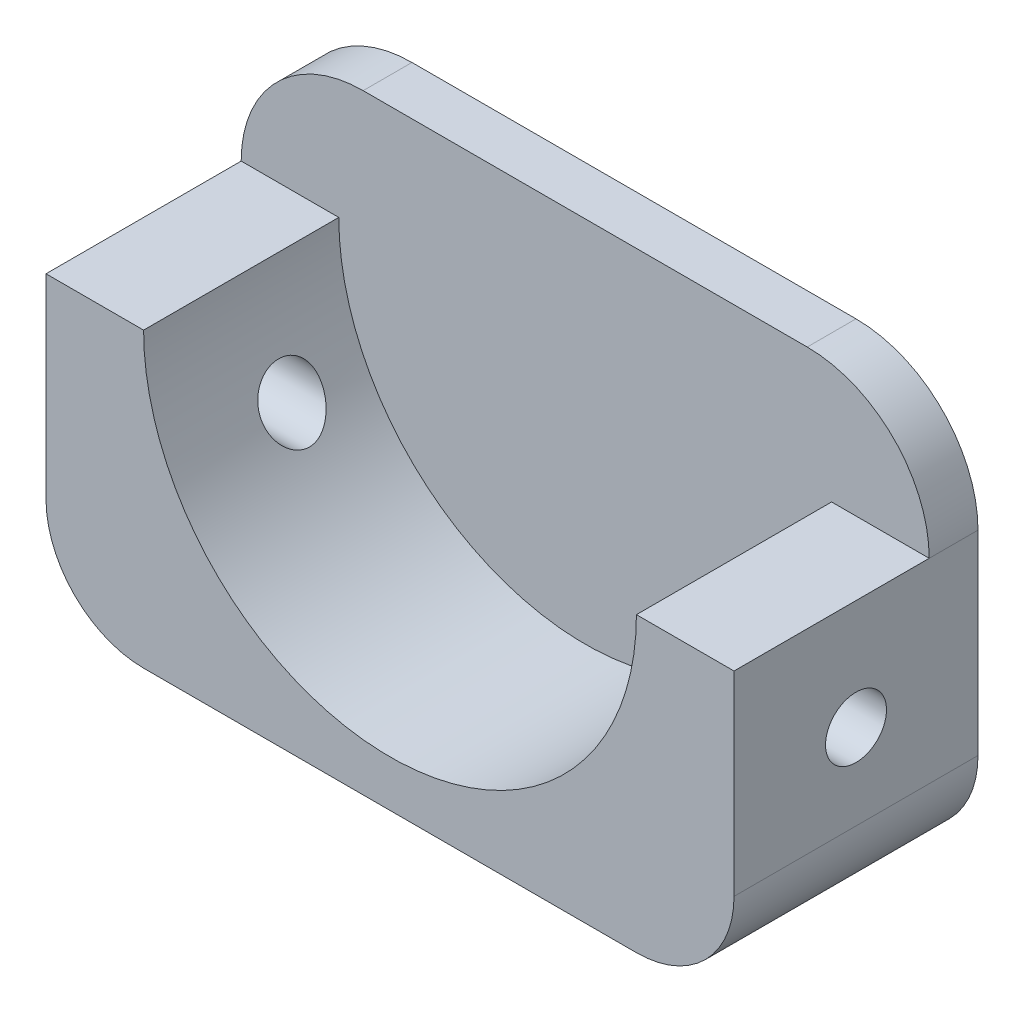
ISO-10303-21;
HEADER;
FILE_DESCRIPTION(('STEP AP214'),'2;1');
FILE_NAME('part.step','',(''),(''),'','','');
FILE_SCHEMA(('AUTOMOTIVE_DESIGN { 1 0 10303 214 1 1 1 1 }'));
ENDSEC;
DATA;
#1=APPLICATION_CONTEXT('core data for automotive mechanical design processes');
#2=APPLICATION_PROTOCOL_DEFINITION('international standard','automotive_design',2000,#1);
#3=PRODUCT_CONTEXT('',#1,'mechanical');
#4=PRODUCT('Part','Part','',(#3));
#5=PRODUCT_RELATED_PRODUCT_CATEGORY('part','',(#4));
#6=PRODUCT_DEFINITION_FORMATION('','',#4);
#7=PRODUCT_DEFINITION_CONTEXT('part definition',#1,'design');
#8=PRODUCT_DEFINITION('design','',#6,#7);
#9=PRODUCT_DEFINITION_SHAPE('','',#8);
#10=(LENGTH_UNIT() NAMED_UNIT(*) SI_UNIT(.MILLI.,.METRE.));
#11=(NAMED_UNIT(*) PLANE_ANGLE_UNIT() SI_UNIT($,.RADIAN.));
#12=(NAMED_UNIT(*) SI_UNIT($,.STERADIAN.) SOLID_ANGLE_UNIT());
#13=UNCERTAINTY_MEASURE_WITH_UNIT(LENGTH_MEASURE(1.E-05),#10,'distance_accuracy_value','');
#14=(GEOMETRIC_REPRESENTATION_CONTEXT(3) GLOBAL_UNCERTAINTY_ASSIGNED_CONTEXT((#13)) GLOBAL_UNIT_ASSIGNED_CONTEXT((#10,
#11,#12)) REPRESENTATION_CONTEXT('',''));
#15=CARTESIAN_POINT('',(0.,0.,0.));
#16=DIRECTION('',(0.,0.,1.));
#17=DIRECTION('',(1.,0.,0.));
#18=AXIS2_PLACEMENT_3D('',#15,#16,#17);
#19=CARTESIAN_POINT('',(0.,0.,8.));
#20=DIRECTION('',(0.,0.,-1.));
#21=DIRECTION('',(-1.,0.,0.));
#22=AXIS2_PLACEMENT_3D('',#19,#20,#21);
#23=CYLINDRICAL_SURFACE('',#22,10.1);
#24=CARTESIAN_POINT('',(8.30346313293436,-5.75,3.));
#25=CARTESIAN_POINT('',(8.30346556023614,-5.74999719009385,2.93819606402658));
#26=CARTESIAN_POINT('',(8.30666253794561,-5.74538818088564,2.87636810832759));
#27=CARTESIAN_POINT('',(8.31918849945746,-5.72723476561262,2.75466607289741));
#28=CARTESIAN_POINT('',(8.32852213400869,-5.71368358257126,2.69479351124059));
#29=CARTESIAN_POINT('',(8.35254823952259,-5.67850195180862,2.57895004306229));
#30=CARTESIAN_POINT('',(8.36721628534955,-5.65690831806253,2.52296271656013));
#31=CARTESIAN_POINT('',(8.40098319782812,-5.60663846307656,2.41573809306071));
#32=CARTESIAN_POINT('',(8.42008305926459,-5.57796065159741,2.36450186613555));
#33=CARTESIAN_POINT('',(8.46335216284389,-5.51210801091915,2.26377187517909));
#34=CARTESIAN_POINT('',(8.4877984122271,-5.47444911849473,2.21471564420032));
#35=CARTESIAN_POINT('',(8.53960366888568,-5.39328194048506,2.12348391792342));
#36=CARTESIAN_POINT('',(8.56696399471795,-5.34977100461607,2.08131155947416));
#37=CARTESIAN_POINT('',(8.62843651103174,-5.25014793771408,1.99765710152075));
#38=CARTESIAN_POINT('',(8.66290868298089,-5.19314862181283,1.95749401480626));
#39=CARTESIAN_POINT('',(8.73326049768454,-5.0739492081012,1.88740434114792));
#40=CARTESIAN_POINT('',(8.76914103633603,-5.01174577039749,1.85748439172002));
#41=CARTESIAN_POINT('',(8.84565705731332,-4.87556761225449,1.80526404736326));
#42=CARTESIAN_POINT('',(8.88633703510027,-4.80108396606182,1.78434437627409));
#43=CARTESIAN_POINT('',(8.96681116872334,-4.64905355749156,1.75651426727098));
#44=CARTESIAN_POINT('',(9.00660508173845,-4.57150597122646,1.74960762393158));
#45=CARTESIAN_POINT('',(9.08497285398777,-4.41374922403769,1.75043532846569));
#46=CARTESIAN_POINT('',(9.12350228106662,-4.33351864144995,1.75848666206291));
#47=CARTESIAN_POINT('',(9.19727046145158,-4.17467071488345,1.79036619859532));
#48=CARTESIAN_POINT('',(9.23251050870979,-4.0960527461233,1.8141881676968));
#49=CARTESIAN_POINT('',(9.2964582732351,-3.94865641420649,1.87551958042695));
#50=CARTESIAN_POINT('',(9.32544625377431,-3.87957203468222,1.91199759398857));
#51=CARTESIAN_POINT('',(9.37898527809888,-3.74828749992423,1.99821041672907));
#52=CARTESIAN_POINT('',(9.40353918532415,-3.68608291198515,2.04793661874442));
#53=CARTESIAN_POINT('',(9.44561319446128,-3.57680112262028,2.15415257635107));
#54=CARTESIAN_POINT('',(9.46357691696196,-3.52885243850489,2.20957115465423));
#55=CARTESIAN_POINT('',(9.49516424072192,-3.44295749338124,2.32877052188886));
#56=CARTESIAN_POINT('',(9.50878982270049,-3.40500666889448,2.392547475701));
#57=CARTESIAN_POINT('',(9.53073812129178,-3.34305828377764,2.52171985345153));
#58=CARTESIAN_POINT('',(9.53936761185198,-3.31826400381453,2.58668216168136));
#59=CARTESIAN_POINT('',(9.55268103474357,-3.27974164080753,2.7201922230024));
#60=CARTESIAN_POINT('',(9.55736594658295,-3.26601081055177,2.788739081494));
#61=CARTESIAN_POINT('',(9.5626663782811,-3.25045786660317,2.92476743305255));
#62=CARTESIAN_POINT('',(9.56342469122017,-3.24821790954192,2.99219595890161));
#63=CARTESIAN_POINT('',(9.56125458213028,-3.25460014895181,3.12647312414225));
#64=CARTESIAN_POINT('',(9.55832651876996,-3.26322128868473,3.19332181931174));
#65=CARTESIAN_POINT('',(9.54884241822029,-3.290868678329,3.32390586918177));
#66=CARTESIAN_POINT('',(9.54232028356174,-3.30979767580442,3.38766435001725));
#67=CARTESIAN_POINT('',(9.52571131927064,-3.35729845384523,3.51097881148743));
#68=CARTESIAN_POINT('',(9.51562444016886,-3.38587036822857,3.57053473378796));
#69=CARTESIAN_POINT('',(9.4918018866433,-3.45209310902203,3.68469389043521));
#70=CARTESIAN_POINT('',(9.4780175634763,-3.48986431524272,3.7392170121708));
#71=CARTESIAN_POINT('',(9.44701350197029,-3.57293960221027,3.84105870376038));
#72=CARTESIAN_POINT('',(9.42979332454585,-3.61824464562142,3.88837635142578));
#73=CARTESIAN_POINT('',(9.39140229025165,-3.71678086275272,3.97652747695715));
#74=CARTESIAN_POINT('',(9.37010362165229,-3.77025212380682,4.01703638635577));
#75=CARTESIAN_POINT('',(9.32437106796839,-3.88197736053812,4.0885548938557));
#76=CARTESIAN_POINT('',(9.29993637955408,-3.94023256029773,4.11956205104861));
#77=CARTESIAN_POINT('',(9.24662633510926,-4.06383074316232,4.17349898079297));
#78=CARTESIAN_POINT('',(9.21756355854991,-4.12938734769868,4.19575271320218));
#79=CARTESIAN_POINT('',(9.15693084584126,-4.26215335638563,4.22907249479892));
#80=CARTESIAN_POINT('',(9.12535997767353,-4.32936336848486,4.24013436386626));
#81=CARTESIAN_POINT('',(9.05753191151787,-4.46964131311799,4.25177958391763));
#82=CARTESIAN_POINT('',(9.02110594527217,-4.54271029853599,4.25136784518746));
#83=CARTESIAN_POINT('',(8.94697035997738,-4.68703692970512,4.23805301428341));
#84=CARTESIAN_POINT('',(8.90926024923946,-4.75829386297282,4.22514508432931));
#85=CARTESIAN_POINT('',(8.83061102455177,-4.90281393527423,4.1858646150199));
#86=CARTESIAN_POINT('',(8.78964858754054,-4.9758030899583,4.15852422443351));
#87=CARTESIAN_POINT('',(8.70879235249355,-5.11600371963007,4.09046619256912));
#88=CARTESIAN_POINT('',(8.66889937032683,-5.18321086538008,4.04973863586004));
#89=CARTESIAN_POINT('',(8.59147977054824,-5.31056408022821,3.95491527218709));
#90=CARTESIAN_POINT('',(8.55398523862478,-5.37062111651449,3.90067264638773));
#91=CARTESIAN_POINT('',(8.4841127080417,-5.48033360478939,3.77979357066801));
#92=CARTESIAN_POINT('',(8.45172571263522,-5.53000739790504,3.71317937411617));
#93=CARTESIAN_POINT('',(8.40263696356101,-5.60420357920238,3.58900329426215));
#94=CARTESIAN_POINT('',(8.38407569525637,-5.6318811967744,3.53404855610785));
#95=CARTESIAN_POINT('',(8.35211906149088,-5.67916584040618,3.41939868453851));
#96=CARTESIAN_POINT('',(8.33871528476283,-5.69878601077014,3.35971146268055));
#97=CARTESIAN_POINT('',(8.32021818120863,-5.72574684147786,3.25005585811093));
#98=CARTESIAN_POINT('',(8.31396714115309,-5.73480641242646,3.20069973595247));
#99=CARTESIAN_POINT('',(8.30558852042351,-5.74693429235806,3.10090111642297));
#100=CARTESIAN_POINT('',(8.3034611512133,-5.75000229409059,3.05045856347333));
#101=CARTESIAN_POINT('',(8.30346313293436,-5.75,3.));
#102=B_SPLINE_CURVE_WITH_KNOTS('',3,(#24,#25,#26,#27,#28,#29,#30,#31,#32,#33,#34,#35,#36,#37,
#38,#39,#40,#41,#42,#43,#44,#45,#46,#47,#48,#49,#50,#51,#52,#53,#54,#55,#56,#57,#58,#59,#60,#61,
#62,#63,#64,#65,#66,#67,#68,#69,#70,#71,#72,#73,#74,#75,#76,#77,#78,#79,#80,#81,#82,#83,#84,#85,
#86,#87,#88,#89,#90,#91,#92,#93,#94,#95,#96,#97,#98,#99,#100,#101),.UNSPECIFIED.,.T.,.F.,(4,2,2,
2,2,2,2,2,2,2,2,2,2,2,2,2,2,2,2,2,2,2,2,2,2,2,2,2,2,2,2,2,2,2,2,2,2,2,4),(0.,0.185208540257049,
0.370557605369958,0.555068466888921,0.73962078466274,0.938375655626977,1.13722084406108,
1.36964257432201,1.60221462921272,1.86325096474346,2.12435797662791,2.39106151588015,
2.65765969516726,2.90627848045937,3.15473613381798,3.37990014945162,3.60496121120132,
3.81411254220272,4.02321192193534,4.22465102254322,4.42607052550246,4.62562179774968,
4.82517583934971,5.0274965366176,5.22984310606403,5.44007553724359,5.65036192991777,
5.87466290774537,6.0990476302793,6.34294896357129,6.5869447586933,6.84989008414711,
7.11303060501039,7.37916487282195,7.6448249882095,7.83686487635993,8.02859022878903,
8.17979221196426,8.33100194864483),.UNSPECIFIED.);
#103=CARTESIAN_POINT('',(8.30346313293436,-5.75,3.));
#104=VERTEX_POINT('',#103);
#105=EDGE_CURVE('E223',#104,#104,#102,.T.);
#106=ORIENTED_EDGE('',*,*,#105,.T.);
#107=EDGE_LOOP('',(#106));
#108=FACE_BOUND('',#107,.T.);
#109=CARTESIAN_POINT('',(-8.30346313293436,-5.75,3.));
#110=CARTESIAN_POINT('',(-8.30346556023614,-5.74999719009385,3.06180393597342));
#111=CARTESIAN_POINT('',(-8.30666253794561,-5.74538818088564,3.12363189167241));
#112=CARTESIAN_POINT('',(-8.31918849945746,-5.72723476561263,3.24533392710259));
#113=CARTESIAN_POINT('',(-8.32852213400869,-5.71368358257127,3.30520648875941));
#114=CARTESIAN_POINT('',(-8.35254823952259,-5.67850195180862,3.42104995693771));
#115=CARTESIAN_POINT('',(-8.36721628534955,-5.65690831806253,3.47703728343987));
#116=CARTESIAN_POINT('',(-8.40098319782812,-5.60663846307656,3.58426190693929));
#117=CARTESIAN_POINT('',(-8.42008305926459,-5.57796065159741,3.63549813386445));
#118=CARTESIAN_POINT('',(-8.46335216284388,-5.51210801091915,3.73622812482091));
#119=CARTESIAN_POINT('',(-8.4877984122271,-5.47444911849473,3.78528435579968));
#120=CARTESIAN_POINT('',(-8.53960366888568,-5.39328194048506,3.87651608207658));
#121=CARTESIAN_POINT('',(-8.56696399471795,-5.34977100461607,3.91868844052584));
#122=CARTESIAN_POINT('',(-8.62843651103173,-5.25014793771408,4.00234289847925));
#123=CARTESIAN_POINT('',(-8.66290868298089,-5.19314862181284,4.04250598519374));
#124=CARTESIAN_POINT('',(-8.73326049768454,-5.0739492081012,4.11259565885208));
#125=CARTESIAN_POINT('',(-8.76914103633603,-5.01174577039749,4.14251560827998));
#126=CARTESIAN_POINT('',(-8.84565705731331,-4.87556761225449,4.19473595263674));
#127=CARTESIAN_POINT('',(-8.88633703510026,-4.80108396606182,4.21565562372592));
#128=CARTESIAN_POINT('',(-8.96681116872334,-4.64905355749156,4.24348573272902));
#129=CARTESIAN_POINT('',(-9.00660508173845,-4.57150597122646,4.25039237606842));
#130=CARTESIAN_POINT('',(-9.08497285398777,-4.4137492240377,4.24956467153431));
#131=CARTESIAN_POINT('',(-9.12350228106662,-4.33351864144995,4.24151333793709));
#132=CARTESIAN_POINT('',(-9.19727046145158,-4.17467071488346,4.20963380140468));
#133=CARTESIAN_POINT('',(-9.23251050870979,-4.09605274612331,4.1858118323032));
#134=CARTESIAN_POINT('',(-9.2964582732351,-3.94865641420649,4.12448041957305));
#135=CARTESIAN_POINT('',(-9.32544625377431,-3.87957203468222,4.08800240601143));
#136=CARTESIAN_POINT('',(-9.37898527809888,-3.74828749992423,4.00178958327093));
#137=CARTESIAN_POINT('',(-9.40353918532415,-3.68608291198515,3.95206338125558));
#138=CARTESIAN_POINT('',(-9.44561319446128,-3.57680112262028,3.84584742364893));
#139=CARTESIAN_POINT('',(-9.46357691696196,-3.52885243850489,3.79042884534577));
#140=CARTESIAN_POINT('',(-9.49516424072192,-3.44295749338124,3.67122947811114));
#141=CARTESIAN_POINT('',(-9.50878982270049,-3.40500666889449,3.607452524299));
#142=CARTESIAN_POINT('',(-9.53073812129178,-3.34305828377764,3.47828014654847));
#143=CARTESIAN_POINT('',(-9.53936761185198,-3.31826400381453,3.41331783831864));
#144=CARTESIAN_POINT('',(-9.55268103474356,-3.27974164080753,3.2798077769976));
#145=CARTESIAN_POINT('',(-9.55736594658294,-3.26601081055178,3.211260918506));
#146=CARTESIAN_POINT('',(-9.5626663782811,-3.25045786660317,3.07523256694745));
#147=CARTESIAN_POINT('',(-9.56342469122018,-3.24821790954192,3.00780404109839));
#148=CARTESIAN_POINT('',(-9.56125458213028,-3.25460014895182,2.87352687585775));
#149=CARTESIAN_POINT('',(-9.55832651876996,-3.26322128868473,2.80667818068826));
#150=CARTESIAN_POINT('',(-9.54884241822029,-3.290868678329,2.67609413081823));
#151=CARTESIAN_POINT('',(-9.54232028356174,-3.30979767580442,2.61233564998275));
#152=CARTESIAN_POINT('',(-9.52571131927064,-3.35729845384523,2.48902118851257));
#153=CARTESIAN_POINT('',(-9.51562444016886,-3.38587036822857,2.42946526621204));
#154=CARTESIAN_POINT('',(-9.4918018866433,-3.45209310902203,2.31530610956479));
#155=CARTESIAN_POINT('',(-9.4780175634763,-3.48986431524272,2.2607829878292));
#156=CARTESIAN_POINT('',(-9.44701350197029,-3.57293960221028,2.15894129623962));
#157=CARTESIAN_POINT('',(-9.42979332454585,-3.61824464562143,2.11162364857422));
#158=CARTESIAN_POINT('',(-9.39140229025165,-3.71678086275272,2.02347252304284));
#159=CARTESIAN_POINT('',(-9.37010362165229,-3.77025212380682,1.98296361364423));
#160=CARTESIAN_POINT('',(-9.32437106796839,-3.88197736053812,1.9114451061443));
#161=CARTESIAN_POINT('',(-9.29993637955408,-3.94023256029773,1.88043794895139));
#162=CARTESIAN_POINT('',(-9.24662633510926,-4.06383074316232,1.82650101920703));
#163=CARTESIAN_POINT('',(-9.21756355854991,-4.12938734769868,1.80424728679782));
#164=CARTESIAN_POINT('',(-9.15693084584125,-4.26215335638563,1.77092750520108));
#165=CARTESIAN_POINT('',(-9.12535997767353,-4.32936336848486,1.75986563613374));
#166=CARTESIAN_POINT('',(-9.05753191151787,-4.46964131311799,1.74822041608237));
#167=CARTESIAN_POINT('',(-9.02110594527217,-4.54271029853599,1.74863215481254));
#168=CARTESIAN_POINT('',(-8.94697035997738,-4.68703692970513,1.76194698571659));
#169=CARTESIAN_POINT('',(-8.90926024923946,-4.75829386297283,1.77485491567069));
#170=CARTESIAN_POINT('',(-8.83061102455176,-4.90281393527424,1.8141353849801));
#171=CARTESIAN_POINT('',(-8.78964858754054,-4.9758030899583,1.8414757755665));
#172=CARTESIAN_POINT('',(-8.70879235249355,-5.11600371963007,1.90953380743088));
#173=CARTESIAN_POINT('',(-8.66889937032683,-5.18321086538008,1.95026136413996));
#174=CARTESIAN_POINT('',(-8.59147977054824,-5.31056408022821,2.04508472781291));
#175=CARTESIAN_POINT('',(-8.55398523862478,-5.37062111651449,2.09932735361227));
#176=CARTESIAN_POINT('',(-8.48411270804169,-5.48033360478939,2.22020642933199));
#177=CARTESIAN_POINT('',(-8.45172571263521,-5.53000739790505,2.28682062588383));
#178=CARTESIAN_POINT('',(-8.40263696356101,-5.60420357920238,2.41099670573785));
#179=CARTESIAN_POINT('',(-8.38407569525636,-5.6318811967744,2.46595144389215));
#180=CARTESIAN_POINT('',(-8.35211906149088,-5.67916584040618,2.58060131546149));
#181=CARTESIAN_POINT('',(-8.33871528476283,-5.69878601077015,2.64028853731945));
#182=CARTESIAN_POINT('',(-8.32021818120863,-5.72574684147786,2.74994414188907));
#183=CARTESIAN_POINT('',(-8.31396714115309,-5.73480641242646,2.79930026404753));
#184=CARTESIAN_POINT('',(-8.30558852042351,-5.74693429235807,2.89909888357703));
#185=CARTESIAN_POINT('',(-8.3034611512133,-5.75000229409059,2.94954143652667));
#186=CARTESIAN_POINT('',(-8.30346313293436,-5.75,3.));
#187=B_SPLINE_CURVE_WITH_KNOTS('',3,(#109,#110,#111,#112,#113,#114,#115,#116,#117,#118,#119,
#120,#121,#122,#123,#124,#125,#126,#127,#128,#129,#130,#131,#132,#133,#134,#135,#136,#137,#138,
#139,#140,#141,#142,#143,#144,#145,#146,#147,#148,#149,#150,#151,#152,#153,#154,#155,#156,#157,
#158,#159,#160,#161,#162,#163,#164,#165,#166,#167,#168,#169,#170,#171,#172,#173,#174,#175,#176,
#177,#178,#179,#180,#181,#182,#183,#184,#185,#186),.UNSPECIFIED.,.T.,.F.,(4,2,2,2,2,2,2,2,2,2,2,
2,2,2,2,2,2,2,2,2,2,2,2,2,2,2,2,2,2,2,2,2,2,2,2,2,2,2,4),(0.,0.185208540257048,
0.370557605369958,0.555068466888921,0.739620784662741,0.938375655626978,1.13722084406108,
1.36964257432201,1.60221462921272,1.86325096474346,2.12435797662791,2.39106151588015,
2.65765969516726,2.90627848045938,3.15473613381798,3.37990014945162,3.60496121120133,
3.81411254220272,4.02321192193535,4.22465102254322,4.42607052550246,4.62562179774969,
4.82517583934971,5.0274965366176,5.22984310606404,5.44007553724359,5.65036192991777,
5.87466290774537,6.0990476302793,6.34294896357129,6.5869447586933,6.84989008414711,
7.1130306050104,7.37916487282196,7.6448249882095,7.83686487635993,8.02859022878903,
8.17979221196426,8.33100194864483),.UNSPECIFIED.);
#188=CARTESIAN_POINT('',(-8.30346313293436,-5.75,3.));
#189=VERTEX_POINT('',#188);
#190=EDGE_CURVE('E227',#189,#189,#187,.T.);
#191=ORIENTED_EDGE('',*,*,#190,.T.);
#192=EDGE_LOOP('',(#191));
#193=FACE_BOUND('',#192,.T.);
#194=CARTESIAN_POINT('',(0.,0.,0.));
#195=DIRECTION('',(0.,0.,-1.));
#196=DIRECTION('',(1.,0.,0.));
#197=AXIS2_PLACEMENT_3D('',#194,#195,#196);
#198=CIRCLE('',#197,10.1);
#199=CARTESIAN_POINT('',(10.1,0.,0.));
#200=VERTEX_POINT('',#199);
#201=CARTESIAN_POINT('',(-10.1,0.,0.));
#202=VERTEX_POINT('',#201);
#203=EDGE_CURVE('E151',#200,#202,#198,.T.);
#204=ORIENTED_EDGE('',*,*,#203,.T.);
#205=DIRECTION('',(0.,0.,-1.));
#206=VECTOR('',#205,1.);
#207=CARTESIAN_POINT('',(-10.1,0.,8.));
#208=LINE('',#207,#206);
#209=CARTESIAN_POINT('',(-10.1,0.,8.));
#210=VERTEX_POINT('',#209);
#211=EDGE_CURVE('E187',#210,#202,#208,.T.);
#212=ORIENTED_EDGE('',*,*,#211,.F.);
#213=CARTESIAN_POINT('',(0.,0.,8.));
#214=DIRECTION('',(0.,0.,-1.));
#215=DIRECTION('',(1.,0.,0.));
#216=AXIS2_PLACEMENT_3D('',#213,#214,#215);
#217=CIRCLE('',#216,10.1);
#218=CARTESIAN_POINT('',(10.1,0.,8.));
#219=VERTEX_POINT('',#218);
#220=EDGE_CURVE('E161',#219,#210,#217,.T.);
#221=ORIENTED_EDGE('',*,*,#220,.F.);
#222=DIRECTION('',(0.,0.,-1.));
#223=VECTOR('',#222,1.);
#224=CARTESIAN_POINT('',(10.1,0.,8.));
#225=LINE('',#224,#223);
#226=EDGE_CURVE('E174',#219,#200,#225,.T.);
#227=ORIENTED_EDGE('',*,*,#226,.T.);
#228=EDGE_LOOP('',(#204,#212,#221,#227));
#229=FACE_BOUND('',#228,.T.);
#230=ADVANCED_FACE('F37',(#108,#193,#229),#23,.F.);
#231=CARTESIAN_POINT('',(-10.1,0.,8.));
#232=DIRECTION('',(0.,-1.,0.));
#233=DIRECTION('',(1.,0.,0.));
#234=AXIS2_PLACEMENT_3D('',#231,#232,#233);
#235=PLANE('',#234);
#236=DIRECTION('',(-1.,0.,0.));
#237=VECTOR('',#236,1.);
#238=CARTESIAN_POINT('',(-10.1,0.,0.));
#239=LINE('',#238,#237);
#240=CARTESIAN_POINT('',(-14.1,0.,0.));
#241=VERTEX_POINT('',#240);
#242=EDGE_CURVE('E155',#202,#241,#239,.T.);
#243=ORIENTED_EDGE('',*,*,#242,.T.);
#244=DIRECTION('',(0.,0.,-1.));
#245=VECTOR('',#244,1.);
#246=CARTESIAN_POINT('',(-14.1,0.,8.));
#247=LINE('',#246,#245);
#248=CARTESIAN_POINT('',(-14.1,0.,8.));
#249=VERTEX_POINT('',#248);
#250=EDGE_CURVE('E184',#249,#241,#247,.T.);
#251=ORIENTED_EDGE('',*,*,#250,.F.);
#252=DIRECTION('',(-1.,0.,0.));
#253=VECTOR('',#252,1.);
#254=CARTESIAN_POINT('',(-10.1,0.,8.));
#255=LINE('',#254,#253);
#256=EDGE_CURVE('E164',#210,#249,#255,.T.);
#257=ORIENTED_EDGE('',*,*,#256,.F.);
#258=ORIENTED_EDGE('',*,*,#211,.T.);
#259=EDGE_LOOP('',(#243,#251,#257,#258));
#260=FACE_BOUND('',#259,.T.);
#261=ADVANCED_FACE('F274',(#260),#235,.F.);
#262=CARTESIAN_POINT('',(-14.1,0.,8.));
#263=DIRECTION('',(1.,0.,0.));
#264=DIRECTION('',(0.,1.,0.));
#265=AXIS2_PLACEMENT_3D('',#262,#263,#264);
#266=PLANE('',#265);
#267=CARTESIAN_POINT('',(-14.1,-4.5,3.));
#268=DIRECTION('',(-1.,0.,0.));
#269=DIRECTION('',(0.,-1.,0.));
#270=AXIS2_PLACEMENT_3D('',#267,#268,#269);
#271=CIRCLE('',#270,1.25);
#272=CARTESIAN_POINT('',(-14.1,-5.75,3.));
#273=VERTEX_POINT('',#272);
#274=EDGE_CURVE('E312',#273,#273,#271,.T.);
#275=ORIENTED_EDGE('',*,*,#274,.F.);
#276=EDGE_LOOP('',(#275));
#277=FACE_BOUND('',#276,.T.);
#278=DIRECTION('',(0.,1.,0.));
#279=VECTOR('',#278,1.);
#280=CARTESIAN_POINT('',(-14.1,0.,-2.));
#281=LINE('',#280,#279);
#282=CARTESIAN_POINT('',(-14.1,-8.,-2.));
#283=VERTEX_POINT('',#282);
#284=CARTESIAN_POINT('',(-14.1,0.,-2.));
#285=VERTEX_POINT('',#284);
#286=EDGE_CURVE('E217',#283,#285,#281,.T.);
#287=ORIENTED_EDGE('',*,*,#286,.F.);
#288=DIRECTION('',(0.,0.,-1.));
#289=VECTOR('',#288,1.);
#290=CARTESIAN_POINT('',(-14.1,-8.,8.));
#291=LINE('',#290,#289);
#292=CARTESIAN_POINT('',(-14.1,-8.,8.));
#293=VERTEX_POINT('',#292);
#294=EDGE_CURVE('E11',#283,#293,#291,.F.);
#295=ORIENTED_EDGE('',*,*,#294,.T.);
#296=DIRECTION('',(0.,-1.,0.));
#297=VECTOR('',#296,1.);
#298=CARTESIAN_POINT('',(-14.1,0.,8.));
#299=LINE('',#298,#297);
#300=EDGE_CURVE('E167',#249,#293,#299,.T.);
#301=ORIENTED_EDGE('',*,*,#300,.F.);
#302=ORIENTED_EDGE('',*,*,#250,.T.);
#303=DIRECTION('',(0.,0.,1.));
#304=VECTOR('',#303,1.);
#305=CARTESIAN_POINT('',(-14.1,0.,-2.));
#306=LINE('',#305,#304);
#307=EDGE_CURVE('E152',#285,#241,#306,.T.);
#308=ORIENTED_EDGE('',*,*,#307,.F.);
#309=EDGE_LOOP('',(#287,#295,#301,#302,#308));
#310=FACE_BOUND('',#309,.T.);
#311=ADVANCED_FACE('F272',(#277,#310),#266,.F.);
#312=CARTESIAN_POINT('',(-14.1,-12.,8.));
#313=DIRECTION('',(0.,1.,0.));
#314=DIRECTION('',(0.,0.,1.));
#315=AXIS2_PLACEMENT_3D('',#312,#313,#314);
#316=PLANE('',#315);
#317=DIRECTION('',(-1.,0.,0.));
#318=VECTOR('',#317,1.);
#319=CARTESIAN_POINT('',(-14.1,-12.,-2.));
#320=LINE('',#319,#318);
#321=CARTESIAN_POINT('',(10.1,-12.,-2.));
#322=VERTEX_POINT('',#321);
#323=CARTESIAN_POINT('',(-10.1,-12.,-2.));
#324=VERTEX_POINT('',#323);
#325=EDGE_CURVE('E145',#322,#324,#320,.T.);
#326=ORIENTED_EDGE('',*,*,#325,.F.);
#327=DIRECTION('',(0.,0.,-1.));
#328=VECTOR('',#327,1.);
#329=CARTESIAN_POINT('',(10.1,-12.,8.));
#330=LINE('',#329,#328);
#331=CARTESIAN_POINT('',(10.1,-12.,8.));
#332=VERTEX_POINT('',#331);
#333=EDGE_CURVE('E58',#322,#332,#330,.F.);
#334=ORIENTED_EDGE('',*,*,#333,.T.);
#335=DIRECTION('',(1.,0.,0.));
#336=VECTOR('',#335,1.);
#337=CARTESIAN_POINT('',(-14.1,-12.,8.));
#338=LINE('',#337,#336);
#339=CARTESIAN_POINT('',(-10.1,-12.,8.));
#340=VERTEX_POINT('',#339);
#341=EDGE_CURVE('E169',#340,#332,#338,.T.);
#342=ORIENTED_EDGE('',*,*,#341,.F.);
#343=DIRECTION('',(0.,0.,-1.));
#344=VECTOR('',#343,1.);
#345=CARTESIAN_POINT('',(-10.1,-12.,8.));
#346=LINE('',#345,#344);
#347=EDGE_CURVE('E203',#340,#324,#346,.T.);
#348=ORIENTED_EDGE('',*,*,#347,.T.);
#349=EDGE_LOOP('',(#326,#334,#342,#348));
#350=FACE_BOUND('',#349,.T.);
#351=ADVANCED_FACE('F215',(#350),#316,.F.);
#352=CARTESIAN_POINT('',(14.1,0.,8.));
#353=DIRECTION('',(-1.,0.,0.));
#354=DIRECTION('',(0.,-1.,0.));
#355=AXIS2_PLACEMENT_3D('',#352,#353,#354);
#356=PLANE('',#355);
#357=CARTESIAN_POINT('',(14.1000000000001,-4.5,3.));
#358=DIRECTION('',(-1.,0.,0.));
#359=DIRECTION('',(0.,-1.,0.));
#360=AXIS2_PLACEMENT_3D('',#357,#358,#359);
#361=CIRCLE('',#360,1.25);
#362=CARTESIAN_POINT('',(14.1000000000001,-5.75,3.));
#363=VERTEX_POINT('',#362);
#364=EDGE_CURVE('E231',#363,#363,#361,.T.);
#365=ORIENTED_EDGE('',*,*,#364,.T.);
#366=EDGE_LOOP('',(#365));
#367=FACE_BOUND('',#366,.T.);
#368=DIRECTION('',(0.,1.,0.));
#369=VECTOR('',#368,1.);
#370=CARTESIAN_POINT('',(14.1,0.,8.));
#371=LINE('',#370,#369);
#372=CARTESIAN_POINT('',(14.1000000000001,-7.99999999999997,8.));
#373=VERTEX_POINT('',#372);
#374=CARTESIAN_POINT('',(14.1,0.,8.));
#375=VERTEX_POINT('',#374);
#376=EDGE_CURVE('E171',#373,#375,#371,.T.);
#377=ORIENTED_EDGE('',*,*,#376,.F.);
#378=DIRECTION('',(0.,0.,-1.));
#379=VECTOR('',#378,1.);
#380=CARTESIAN_POINT('',(14.1000000000001,-7.99999999999997,8.));
#381=LINE('',#380,#379);
#382=CARTESIAN_POINT('',(14.1000000000001,-7.99999999999997,-2.));
#383=VERTEX_POINT('',#382);
#384=EDGE_CURVE('E144',#373,#383,#381,.T.);
#385=ORIENTED_EDGE('',*,*,#384,.T.);
#386=DIRECTION('',(0.,-1.,0.));
#387=VECTOR('',#386,1.);
#388=CARTESIAN_POINT('',(14.1000000000001,-12.,-2.));
#389=LINE('',#388,#387);
#390=CARTESIAN_POINT('',(14.1,0.,-2.));
#391=VERTEX_POINT('',#390);
#392=EDGE_CURVE('E126',#391,#383,#389,.T.);
#393=ORIENTED_EDGE('',*,*,#392,.F.);
#394=DIRECTION('',(0.,0.,1.));
#395=VECTOR('',#394,1.);
#396=CARTESIAN_POINT('',(14.1,0.,-2.));
#397=LINE('',#396,#395);
#398=CARTESIAN_POINT('',(14.1,0.,0.));
#399=VERTEX_POINT('',#398);
#400=EDGE_CURVE('E141',#391,#399,#397,.T.);
#401=ORIENTED_EDGE('',*,*,#400,.T.);
#402=DIRECTION('',(0.,0.,-1.));
#403=VECTOR('',#402,1.);
#404=CARTESIAN_POINT('',(14.1,0.,8.));
#405=LINE('',#404,#403);
#406=EDGE_CURVE('E182',#375,#399,#405,.T.);
#407=ORIENTED_EDGE('',*,*,#406,.F.);
#408=EDGE_LOOP('',(#377,#385,#393,#401,#407));
#409=FACE_BOUND('',#408,.T.);
#410=ADVANCED_FACE('F139',(#367,#409),#356,.F.);
#411=CARTESIAN_POINT('',(10.1,0.,8.));
#412=DIRECTION('',(0.,-1.,0.));
#413=DIRECTION('',(1.,0.,0.));
#414=AXIS2_PLACEMENT_3D('',#411,#412,#413);
#415=PLANE('',#414);
#416=DIRECTION('',(-1.,0.,0.));
#417=VECTOR('',#416,1.);
#418=CARTESIAN_POINT('',(10.1,0.,0.));
#419=LINE('',#418,#417);
#420=EDGE_CURVE('E165',#399,#200,#419,.T.);
#421=ORIENTED_EDGE('',*,*,#420,.T.);
#422=ORIENTED_EDGE('',*,*,#226,.F.);
#423=DIRECTION('',(-1.,0.,0.));
#424=VECTOR('',#423,1.);
#425=CARTESIAN_POINT('',(10.1,0.,8.));
#426=LINE('',#425,#424);
#427=EDGE_CURVE('E173',#375,#219,#426,.T.);
#428=ORIENTED_EDGE('',*,*,#427,.F.);
#429=ORIENTED_EDGE('',*,*,#406,.T.);
#430=EDGE_LOOP('',(#421,#422,#428,#429));
#431=FACE_BOUND('',#430,.T.);
#432=ADVANCED_FACE('F263',(#431),#415,.F.);
#433=CARTESIAN_POINT('',(0.,0.,8.));
#434=DIRECTION('',(0.,0.,1.));
#435=DIRECTION('',(1.,0.,0.));
#436=AXIS2_PLACEMENT_3D('',#433,#434,#435);
#437=PLANE('',#436);
#438=ORIENTED_EDGE('',*,*,#341,.T.);
#439=CARTESIAN_POINT('',(10.1000000000001,-8.,8.));
#440=DIRECTION('',(0.,0.,1.));
#441=DIRECTION('',(1.,0.,0.));
#442=AXIS2_PLACEMENT_3D('',#439,#440,#441);
#443=CIRCLE('',#442,4.);
#444=EDGE_CURVE('E45',#332,#373,#443,.T.);
#445=ORIENTED_EDGE('',*,*,#444,.T.);
#446=ORIENTED_EDGE('',*,*,#376,.T.);
#447=ORIENTED_EDGE('',*,*,#427,.T.);
#448=ORIENTED_EDGE('',*,*,#220,.T.);
#449=ORIENTED_EDGE('',*,*,#256,.T.);
#450=ORIENTED_EDGE('',*,*,#300,.T.);
#451=CARTESIAN_POINT('',(-10.1,-8.,8.));
#452=DIRECTION('',(0.,0.,1.));
#453=DIRECTION('',(1.,0.,0.));
#454=AXIS2_PLACEMENT_3D('',#451,#452,#453);
#455=CIRCLE('',#454,4.);
#456=EDGE_CURVE('E207',#293,#340,#455,.T.);
#457=ORIENTED_EDGE('',*,*,#456,.T.);
#458=EDGE_LOOP('',(#438,#445,#446,#447,#448,#449,#450,#457));
#459=FACE_BOUND('',#458,.T.);
#460=ADVANCED_FACE('F210',(#459),#437,.T.);
#461=CARTESIAN_POINT('',(0.,0.,0.));
#462=DIRECTION('',(0.,0.,-1.));
#463=DIRECTION('',(-1.,0.,0.));
#464=AXIS2_PLACEMENT_3D('',#461,#462,#463);
#465=PLANE('',#464);
#466=DIRECTION('',(1.,0.,0.));
#467=VECTOR('',#466,1.);
#468=CARTESIAN_POINT('',(13.1837020597403,5.,0.));
#469=LINE('',#468,#467);
#470=CARTESIAN_POINT('',(-9.1,5.,0.));
#471=VERTEX_POINT('',#470);
#472=CARTESIAN_POINT('',(9.1,5.,0.));
#473=VERTEX_POINT('',#472);
#474=EDGE_CURVE('E146',#471,#473,#469,.T.);
#475=ORIENTED_EDGE('',*,*,#474,.F.);
#476=CARTESIAN_POINT('',(-9.1,0.,0.));
#477=DIRECTION('',(0.,0.,-1.));
#478=DIRECTION('',(-1.,0.,0.));
#479=AXIS2_PLACEMENT_3D('',#476,#477,#478);
#480=CIRCLE('',#479,5.);
#481=EDGE_CURVE('E133',#471,#241,#480,.F.);
#482=ORIENTED_EDGE('',*,*,#481,.T.);
#483=ORIENTED_EDGE('',*,*,#242,.F.);
#484=ORIENTED_EDGE('',*,*,#203,.F.);
#485=ORIENTED_EDGE('',*,*,#420,.F.);
#486=CARTESIAN_POINT('',(9.1,0.,0.));
#487=DIRECTION('',(0.,0.,-1.));
#488=DIRECTION('',(-1.,0.,0.));
#489=AXIS2_PLACEMENT_3D('',#486,#487,#488);
#490=CIRCLE('',#489,5.);
#491=EDGE_CURVE('E149',#399,#473,#490,.F.);
#492=ORIENTED_EDGE('',*,*,#491,.T.);
#493=EDGE_LOOP('',(#475,#482,#483,#484,#485,#492));
#494=FACE_BOUND('',#493,.T.);
#495=ADVANCED_FACE('F255',(#494),#465,.F.);
#496=CARTESIAN_POINT('',(13.1837020597403,5.,-2.));
#497=DIRECTION('',(0.,-1.,0.));
#498=DIRECTION('',(0.,0.,-1.));
#499=AXIS2_PLACEMENT_3D('',#496,#497,#498);
#500=PLANE('',#499);
#501=DIRECTION('',(1.,0.,0.));
#502=VECTOR('',#501,1.);
#503=CARTESIAN_POINT('',(13.1837020597403,5.,-2.));
#504=LINE('',#503,#502);
#505=CARTESIAN_POINT('',(-9.1,5.,-2.));
#506=VERTEX_POINT('',#505);
#507=CARTESIAN_POINT('',(9.1,5.,-2.));
#508=VERTEX_POINT('',#507);
#509=EDGE_CURVE('E128',#506,#508,#504,.T.);
#510=ORIENTED_EDGE('',*,*,#509,.F.);
#511=DIRECTION('',(0.,0.,1.));
#512=VECTOR('',#511,1.);
#513=CARTESIAN_POINT('',(-9.1,5.,-2.));
#514=LINE('',#513,#512);
#515=EDGE_CURVE('E192',#506,#471,#514,.T.);
#516=ORIENTED_EDGE('',*,*,#515,.T.);
#517=ORIENTED_EDGE('',*,*,#474,.T.);
#518=DIRECTION('',(0.,0.,1.));
#519=VECTOR('',#518,1.);
#520=CARTESIAN_POINT('',(9.1,5.,-2.));
#521=LINE('',#520,#519);
#522=EDGE_CURVE('E190',#473,#508,#521,.F.);
#523=ORIENTED_EDGE('',*,*,#522,.T.);
#524=EDGE_LOOP('',(#510,#516,#517,#523));
#525=FACE_BOUND('',#524,.T.);
#526=ADVANCED_FACE('F254',(#525),#500,.F.);
#527=CARTESIAN_POINT('',(0.,0.,-2.));
#528=DIRECTION('',(0.,0.,-1.));
#529=DIRECTION('',(-1.,0.,0.));
#530=AXIS2_PLACEMENT_3D('',#527,#528,#529);
#531=PLANE('',#530);
#532=ORIENTED_EDGE('',*,*,#392,.T.);
#533=CARTESIAN_POINT('',(10.1000000000001,-8.,-2.));
#534=DIRECTION('',(0.,0.,-1.));
#535=DIRECTION('',(-1.,0.,0.));
#536=AXIS2_PLACEMENT_3D('',#533,#534,#535);
#537=CIRCLE('',#536,4.);
#538=EDGE_CURVE('E201',#383,#322,#537,.T.);
#539=ORIENTED_EDGE('',*,*,#538,.T.);
#540=ORIENTED_EDGE('',*,*,#325,.T.);
#541=CARTESIAN_POINT('',(-10.1,-8.,-2.));
#542=DIRECTION('',(0.,0.,-1.));
#543=DIRECTION('',(-1.,0.,0.));
#544=AXIS2_PLACEMENT_3D('',#541,#542,#543);
#545=CIRCLE('',#544,4.);
#546=EDGE_CURVE('E199',#324,#283,#545,.T.);
#547=ORIENTED_EDGE('',*,*,#546,.T.);
#548=ORIENTED_EDGE('',*,*,#286,.T.);
#549=CARTESIAN_POINT('',(-9.1,0.,-2.));
#550=DIRECTION('',(0.,0.,-1.));
#551=DIRECTION('',(-1.,0.,0.));
#552=AXIS2_PLACEMENT_3D('',#549,#550,#551);
#553=CIRCLE('',#552,5.);
#554=EDGE_CURVE('E132',#285,#506,#553,.T.);
#555=ORIENTED_EDGE('',*,*,#554,.T.);
#556=ORIENTED_EDGE('',*,*,#509,.T.);
#557=CARTESIAN_POINT('',(9.1,0.,-2.));
#558=DIRECTION('',(0.,0.,-1.));
#559=DIRECTION('',(-1.,0.,0.));
#560=AXIS2_PLACEMENT_3D('',#557,#558,#559);
#561=CIRCLE('',#560,5.);
#562=EDGE_CURVE('E123',#508,#391,#561,.T.);
#563=ORIENTED_EDGE('',*,*,#562,.T.);
#564=EDGE_LOOP('',(#532,#539,#540,#547,#548,#555,#556,#563));
#565=FACE_BOUND('',#564,.T.);
#566=ADVANCED_FACE('F125',(#565),#531,.T.);
#567=CARTESIAN_POINT('',(14.1000000000001,-4.5,3.));
#568=DIRECTION('',(-1.,0.,0.));
#569=DIRECTION('',(0.,-1.,0.));
#570=AXIS2_PLACEMENT_3D('',#567,#568,#569);
#571=CYLINDRICAL_SURFACE('',#570,1.25);
#572=ORIENTED_EDGE('',*,*,#364,.F.);
#573=EDGE_LOOP('',(#572));
#574=FACE_BOUND('',#573,.T.);
#575=ORIENTED_EDGE('',*,*,#105,.F.);
#576=EDGE_LOOP('',(#575));
#577=FACE_BOUND('',#576,.T.);
#578=ADVANCED_FACE('F245',(#574,#577),#571,.F.);
#579=ORIENTED_EDGE('',*,*,#274,.T.);
#580=EDGE_LOOP('',(#579));
#581=FACE_BOUND('',#580,.T.);
#582=ORIENTED_EDGE('',*,*,#190,.F.);
#583=EDGE_LOOP('',(#582));
#584=FACE_BOUND('',#583,.T.);
#585=ADVANCED_FACE('F249',(#581,#584),#571,.F.);
#586=CARTESIAN_POINT('',(-9.1,0.,-2.));
#587=DIRECTION('',(0.,0.,1.));
#588=DIRECTION('',(1.,0.,0.));
#589=AXIS2_PLACEMENT_3D('',#586,#587,#588);
#590=CYLINDRICAL_SURFACE('',#589,5.);
#591=ORIENTED_EDGE('',*,*,#554,.F.);
#592=ORIENTED_EDGE('',*,*,#307,.T.);
#593=ORIENTED_EDGE('',*,*,#481,.F.);
#594=ORIENTED_EDGE('',*,*,#515,.F.);
#595=EDGE_LOOP('',(#591,#592,#593,#594));
#596=FACE_BOUND('',#595,.T.);
#597=ADVANCED_FACE('F287',(#596),#590,.T.);
#598=CARTESIAN_POINT('',(9.1,0.,-2.));
#599=DIRECTION('',(0.,0.,1.));
#600=DIRECTION('',(1.,0.,0.));
#601=AXIS2_PLACEMENT_3D('',#598,#599,#600);
#602=CYLINDRICAL_SURFACE('',#601,5.);
#603=ORIENTED_EDGE('',*,*,#562,.F.);
#604=ORIENTED_EDGE('',*,*,#522,.F.);
#605=ORIENTED_EDGE('',*,*,#491,.F.);
#606=ORIENTED_EDGE('',*,*,#400,.F.);
#607=EDGE_LOOP('',(#603,#604,#605,#606));
#608=FACE_BOUND('',#607,.T.);
#609=ADVANCED_FACE('F148',(#608),#602,.T.);
#610=CARTESIAN_POINT('',(10.1000000000001,-8.,8.));
#611=DIRECTION('',(0.,0.,-1.));
#612=DIRECTION('',(-1.,0.,0.));
#613=AXIS2_PLACEMENT_3D('',#610,#611,#612);
#614=CYLINDRICAL_SURFACE('',#613,4.);
#615=ORIENTED_EDGE('',*,*,#444,.F.);
#616=ORIENTED_EDGE('',*,*,#333,.F.);
#617=ORIENTED_EDGE('',*,*,#538,.F.);
#618=ORIENTED_EDGE('',*,*,#384,.F.);
#619=EDGE_LOOP('',(#615,#616,#617,#618));
#620=FACE_BOUND('',#619,.T.);
#621=ADVANCED_FACE('F213',(#620),#614,.T.);
#622=CARTESIAN_POINT('',(-10.1,-8.,8.));
#623=DIRECTION('',(0.,0.,-1.));
#624=DIRECTION('',(-1.,0.,0.));
#625=AXIS2_PLACEMENT_3D('',#622,#623,#624);
#626=CYLINDRICAL_SURFACE('',#625,4.);
#627=ORIENTED_EDGE('',*,*,#456,.F.);
#628=ORIENTED_EDGE('',*,*,#294,.F.);
#629=ORIENTED_EDGE('',*,*,#546,.F.);
#630=ORIENTED_EDGE('',*,*,#347,.F.);
#631=EDGE_LOOP('',(#627,#628,#629,#630));
#632=FACE_BOUND('',#631,.T.);
#633=ADVANCED_FACE('F39',(#632),#626,.T.);
#634=CLOSED_SHELL('',(#230,#261,#311,#351,#410,#432,#460,#495,#526,#566,#578,#585,#597,#609,
#621,#633));
#635=MANIFOLD_SOLID_BREP('B2',#634);
#636=ADVANCED_BREP_SHAPE_REPRESENTATION('',(#18,#635),#14);
#637=SHAPE_DEFINITION_REPRESENTATION(#9,#636);
ENDSEC;
END-ISO-10303-21;
